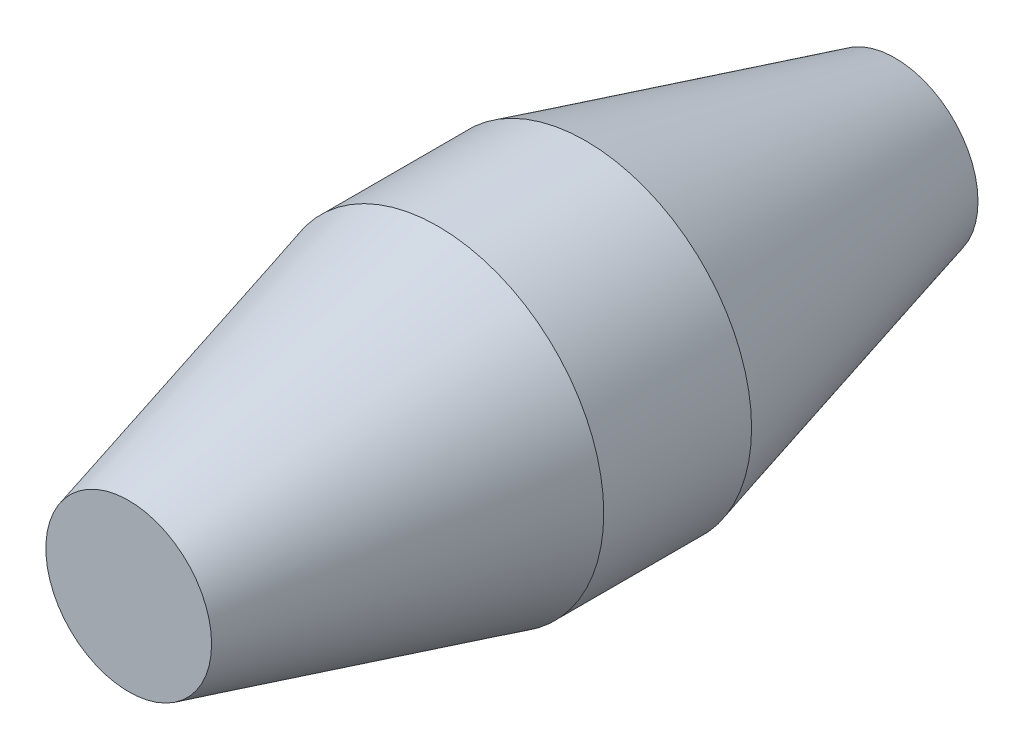
ISO-10303-21;
HEADER;
FILE_DESCRIPTION(('STEP AP214'),'2;1');
FILE_NAME('part.step','',(''),(''),'','','');
FILE_SCHEMA(('AUTOMOTIVE_DESIGN { 1 0 10303 214 1 1 1 1 }'));
ENDSEC;
DATA;
#1=APPLICATION_CONTEXT('core data for automotive mechanical design processes');
#2=APPLICATION_PROTOCOL_DEFINITION('international standard','automotive_design',2000,#1);
#3=PRODUCT_CONTEXT('',#1,'mechanical');
#4=PRODUCT('Part','Part','',(#3));
#5=PRODUCT_RELATED_PRODUCT_CATEGORY('part','',(#4));
#6=PRODUCT_DEFINITION_FORMATION('','',#4);
#7=PRODUCT_DEFINITION_CONTEXT('part definition',#1,'design');
#8=PRODUCT_DEFINITION('design','',#6,#7);
#9=PRODUCT_DEFINITION_SHAPE('','',#8);
#10=(LENGTH_UNIT() NAMED_UNIT(*) SI_UNIT(.MILLI.,.METRE.));
#11=(NAMED_UNIT(*) PLANE_ANGLE_UNIT() SI_UNIT($,.RADIAN.));
#12=(NAMED_UNIT(*) SI_UNIT($,.STERADIAN.) SOLID_ANGLE_UNIT());
#13=UNCERTAINTY_MEASURE_WITH_UNIT(LENGTH_MEASURE(1.E-05),#10,'distance_accuracy_value','');
#14=(GEOMETRIC_REPRESENTATION_CONTEXT(3) GLOBAL_UNCERTAINTY_ASSIGNED_CONTEXT((#13)) GLOBAL_UNIT_ASSIGNED_CONTEXT((#10,
#11,#12)) REPRESENTATION_CONTEXT('',''));
#15=CARTESIAN_POINT('',(0.,0.,0.));
#16=DIRECTION('',(0.,0.,1.));
#17=DIRECTION('',(1.,0.,0.));
#18=AXIS2_PLACEMENT_3D('',#15,#16,#17);
#19=CARTESIAN_POINT('',(0.,0.,-58.7248));
#20=DIRECTION('',(0.,0.,1.));
#21=DIRECTION('',(1.,0.,0.));
#22=AXIS2_PLACEMENT_3D('',#19,#20,#21);
#23=CYLINDRICAL_SURFACE('',#22,12.7);
#24=CARTESIAN_POINT('',(0.,0.,-23.6985226280624));
#25=DIRECTION('',(0.,0.,1.));
#26=DIRECTION('',(1.,0.,0.));
#27=AXIS2_PLACEMENT_3D('',#24,#25,#26);
#28=CIRCLE('',#27,12.7);
#29=CARTESIAN_POINT('',(12.7,0.,-23.6985226280624));
#30=VERTEX_POINT('',#29);
#31=EDGE_CURVE('E10',#30,#30,#28,.F.);
#32=ORIENTED_EDGE('',*,*,#31,.T.);
#33=EDGE_LOOP('',(#32));
#34=FACE_BOUND('',#33,.T.);
#35=CARTESIAN_POINT('',(0.,0.,-35.0262773719376));
#36=DIRECTION('',(0.,0.,1.));
#37=DIRECTION('',(1.,0.,0.));
#38=AXIS2_PLACEMENT_3D('',#35,#36,#37);
#39=CIRCLE('',#38,12.7);
#40=CARTESIAN_POINT('',(12.7,0.,-35.0262773719376));
#41=VERTEX_POINT('',#40);
#42=EDGE_CURVE('E46',#41,#41,#39,.T.);
#43=ORIENTED_EDGE('',*,*,#42,.T.);
#44=EDGE_LOOP('',(#43));
#45=FACE_BOUND('',#44,.T.);
#46=ADVANCED_FACE('F31',(#34,#45),#23,.T.);
#47=CARTESIAN_POINT('',(0.,0.,-58.7248));
#48=DIRECTION('',(0.,0.,1.));
#49=DIRECTION('',(1.,0.,0.));
#50=AXIS2_PLACEMENT_3D('',#47,#48,#49);
#51=PLANE('',#50);
#52=CARTESIAN_POINT('',(0.,0.,-58.7248));
#53=DIRECTION('',(0.,0.,1.));
#54=DIRECTION('',(1.,0.,0.));
#55=AXIS2_PLACEMENT_3D('',#52,#53,#54);
#56=CIRCLE('',#55,6.35);
#57=CARTESIAN_POINT('',(6.35,0.,-58.7248));
#58=VERTEX_POINT('',#57);
#59=EDGE_CURVE('E42',#58,#58,#56,.F.);
#60=ORIENTED_EDGE('',*,*,#59,.T.);
#61=EDGE_LOOP('',(#60));
#62=FACE_BOUND('',#61,.T.);
#63=ADVANCED_FACE('F62',(#62),#51,.F.);
#64=CARTESIAN_POINT('',(0.,0.,0.));
#65=DIRECTION('',(0.,0.,1.));
#66=DIRECTION('',(1.,0.,0.));
#67=AXIS2_PLACEMENT_3D('',#64,#65,#66);
#68=PLANE('',#67);
#69=CARTESIAN_POINT('',(0.,0.,0.));
#70=DIRECTION('',(0.,0.,1.));
#71=DIRECTION('',(1.,0.,0.));
#72=AXIS2_PLACEMENT_3D('',#69,#70,#71);
#73=CIRCLE('',#72,6.34999999999997);
#74=CARTESIAN_POINT('',(6.34999999999997,0.,0.));
#75=VERTEX_POINT('',#74);
#76=EDGE_CURVE('E38',#75,#75,#73,.T.);
#77=ORIENTED_EDGE('',*,*,#76,.T.);
#78=EDGE_LOOP('',(#77));
#79=FACE_BOUND('',#78,.T.);
#80=ADVANCED_FACE('F55',(#79),#68,.T.);
#81=CARTESIAN_POINT('',(0.,0.,-35.0262773719376));
#82=DIRECTION('',(0.,0.,1.));
#83=DIRECTION('',(1.,0.,0.));
#84=AXIS2_PLACEMENT_3D('',#81,#82,#83);
#85=CONICAL_SURFACE('',#84,12.7,0.26179938779915);
#86=ORIENTED_EDGE('',*,*,#59,.F.);
#87=EDGE_LOOP('',(#86));
#88=FACE_BOUND('',#87,.T.);
#89=ORIENTED_EDGE('',*,*,#42,.F.);
#90=EDGE_LOOP('',(#89));
#91=FACE_BOUND('',#90,.T.);
#92=ADVANCED_FACE('F53',(#88,#91),#85,.T.);
#93=CARTESIAN_POINT('',(0.,0.,0.));
#94=DIRECTION('',(0.,0.,-1.));
#95=DIRECTION('',(-1.,0.,0.));
#96=AXIS2_PLACEMENT_3D('',#93,#94,#95);
#97=CONICAL_SURFACE('',#96,6.34999999999997,0.26179938779915);
#98=ORIENTED_EDGE('',*,*,#31,.F.);
#99=EDGE_LOOP('',(#98));
#100=FACE_BOUND('',#99,.T.);
#101=ORIENTED_EDGE('',*,*,#76,.F.);
#102=EDGE_LOOP('',(#101));
#103=FACE_BOUND('',#102,.T.);
#104=ADVANCED_FACE('F33',(#100,#103),#97,.T.);
#105=CLOSED_SHELL('',(#46,#63,#80,#92,#104));
#106=MANIFOLD_SOLID_BREP('B2',#105);
#107=ADVANCED_BREP_SHAPE_REPRESENTATION('',(#18,#106),#14);
#108=SHAPE_DEFINITION_REPRESENTATION(#9,#107);
ENDSEC;
END-ISO-10303-21;
